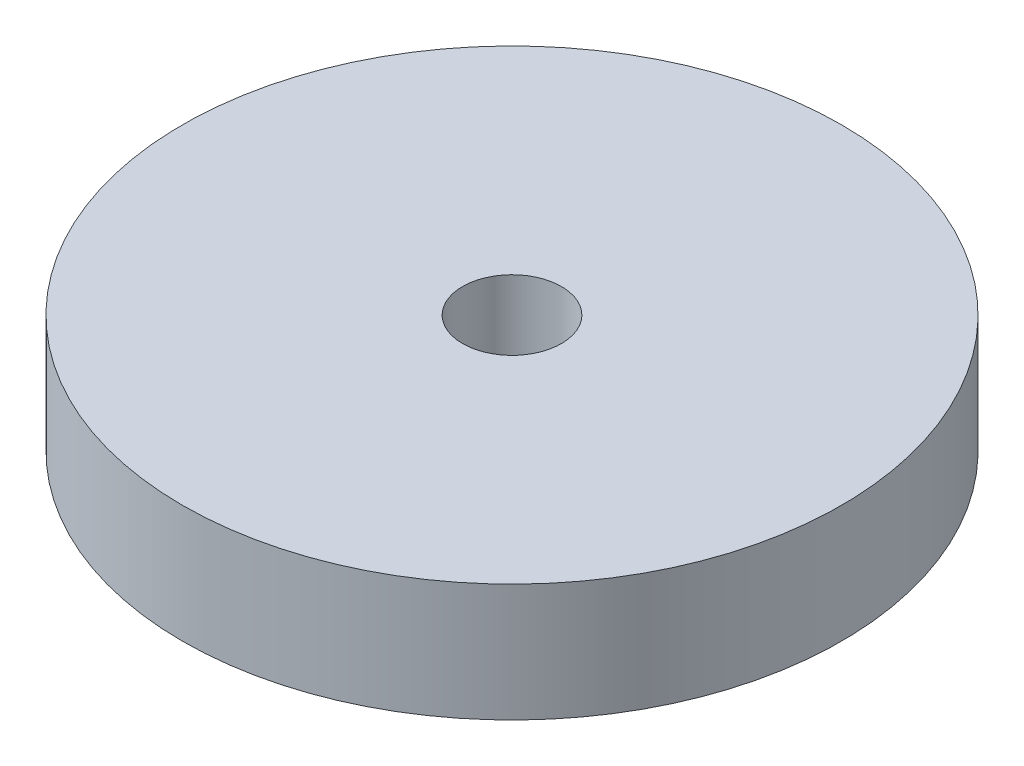
ISO-10303-21;
HEADER;
FILE_DESCRIPTION(('STEP AP214'),'2;1');
FILE_NAME('part.step','',(''),(''),'','','');
FILE_SCHEMA(('AUTOMOTIVE_DESIGN { 1 0 10303 214 1 1 1 1 }'));
ENDSEC;
DATA;
#1=APPLICATION_CONTEXT('core data for automotive mechanical design processes');
#2=APPLICATION_PROTOCOL_DEFINITION('international standard','automotive_design',2000,#1);
#3=PRODUCT_CONTEXT('',#1,'mechanical');
#4=PRODUCT('Part','Part','',(#3));
#5=PRODUCT_RELATED_PRODUCT_CATEGORY('part','',(#4));
#6=PRODUCT_DEFINITION_FORMATION('','',#4);
#7=PRODUCT_DEFINITION_CONTEXT('part definition',#1,'design');
#8=PRODUCT_DEFINITION('design','',#6,#7);
#9=PRODUCT_DEFINITION_SHAPE('','',#8);
#10=(LENGTH_UNIT() NAMED_UNIT(*) SI_UNIT(.MILLI.,.METRE.));
#11=(NAMED_UNIT(*) PLANE_ANGLE_UNIT() SI_UNIT($,.RADIAN.));
#12=(NAMED_UNIT(*) SI_UNIT($,.STERADIAN.) SOLID_ANGLE_UNIT());
#13=UNCERTAINTY_MEASURE_WITH_UNIT(LENGTH_MEASURE(1.E-05),#10,'distance_accuracy_value','');
#14=(GEOMETRIC_REPRESENTATION_CONTEXT(3) GLOBAL_UNCERTAINTY_ASSIGNED_CONTEXT((#13)) GLOBAL_UNIT_ASSIGNED_CONTEXT((#10,
#11,#12)) REPRESENTATION_CONTEXT('',''));
#15=CARTESIAN_POINT('',(0.,0.,0.));
#16=DIRECTION('',(0.,0.,1.));
#17=DIRECTION('',(1.,0.,0.));
#18=AXIS2_PLACEMENT_3D('',#15,#16,#17);
#19=CARTESIAN_POINT('',(0.,2.5,0.));
#20=DIRECTION('',(0.,1.,0.));
#21=DIRECTION('',(0.,0.,1.));
#22=AXIS2_PLACEMENT_3D('',#19,#20,#21);
#23=PLANE('',#22);
#24=CARTESIAN_POINT('',(0.,2.5,0.));
#25=DIRECTION('',(0.,1.,0.));
#26=DIRECTION('',(0.,0.,1.));
#27=AXIS2_PLACEMENT_3D('',#24,#25,#26);
#28=CIRCLE('',#27,14.);
#29=CARTESIAN_POINT('',(0.,2.5,14.));
#30=VERTEX_POINT('',#29);
#31=EDGE_CURVE('E10',#30,#30,#28,.T.);
#32=ORIENTED_EDGE('',*,*,#31,.T.);
#33=EDGE_LOOP('',(#32));
#34=FACE_BOUND('',#33,.T.);
#35=CARTESIAN_POINT('',(0.,2.5,0.));
#36=DIRECTION('',(0.,1.,0.));
#37=DIRECTION('',(0.,0.,1.));
#38=AXIS2_PLACEMENT_3D('',#35,#36,#37);
#39=CIRCLE('',#38,2.1);
#40=CARTESIAN_POINT('',(0.,2.5,2.1));
#41=VERTEX_POINT('',#40);
#42=EDGE_CURVE('E54',#41,#41,#39,.T.);
#43=ORIENTED_EDGE('',*,*,#42,.F.);
#44=EDGE_LOOP('',(#43));
#45=FACE_BOUND('',#44,.T.);
#46=ADVANCED_FACE('F43',(#34,#45),#23,.T.);
#47=CARTESIAN_POINT('',(0.,-2.5,0.));
#48=DIRECTION('',(0.,1.,0.));
#49=DIRECTION('',(0.,0.,1.));
#50=AXIS2_PLACEMENT_3D('',#47,#48,#49);
#51=PLANE('',#50);
#52=CARTESIAN_POINT('',(0.,-2.5,0.));
#53=DIRECTION('',(0.,1.,0.));
#54=DIRECTION('',(0.,0.,1.));
#55=AXIS2_PLACEMENT_3D('',#52,#53,#54);
#56=CIRCLE('',#55,14.);
#57=CARTESIAN_POINT('',(0.,-2.5,14.));
#58=VERTEX_POINT('',#57);
#59=EDGE_CURVE('E47',#58,#58,#56,.T.);
#60=ORIENTED_EDGE('',*,*,#59,.F.);
#61=EDGE_LOOP('',(#60));
#62=FACE_BOUND('',#61,.T.);
#63=CARTESIAN_POINT('',(0.,-2.5,0.));
#64=DIRECTION('',(0.,1.,0.));
#65=DIRECTION('',(0.,0.,1.));
#66=AXIS2_PLACEMENT_3D('',#63,#64,#65);
#67=CIRCLE('',#66,2.1);
#68=CARTESIAN_POINT('',(0.,-2.5,2.1));
#69=VERTEX_POINT('',#68);
#70=EDGE_CURVE('E56',#69,#69,#67,.T.);
#71=ORIENTED_EDGE('',*,*,#70,.T.);
#72=EDGE_LOOP('',(#71));
#73=FACE_BOUND('',#72,.T.);
#74=ADVANCED_FACE('F66',(#62,#73),#51,.F.);
#75=CARTESIAN_POINT('',(0.,2.5,0.));
#76=DIRECTION('',(0.,-1.,0.));
#77=DIRECTION('',(0.,0.,-1.));
#78=AXIS2_PLACEMENT_3D('',#75,#76,#77);
#79=CYLINDRICAL_SURFACE('',#78,14.);
#80=ORIENTED_EDGE('',*,*,#31,.F.);
#81=EDGE_LOOP('',(#80));
#82=FACE_BOUND('',#81,.T.);
#83=ORIENTED_EDGE('',*,*,#59,.T.);
#84=EDGE_LOOP('',(#83));
#85=FACE_BOUND('',#84,.T.);
#86=ADVANCED_FACE('F45',(#82,#85),#79,.T.);
#87=CARTESIAN_POINT('',(0.,2.5,0.));
#88=DIRECTION('',(0.,-1.,0.));
#89=DIRECTION('',(0.,0.,-1.));
#90=AXIS2_PLACEMENT_3D('',#87,#88,#89);
#91=CYLINDRICAL_SURFACE('',#90,2.1);
#92=ORIENTED_EDGE('',*,*,#42,.T.);
#93=EDGE_LOOP('',(#92));
#94=FACE_BOUND('',#93,.T.);
#95=ORIENTED_EDGE('',*,*,#70,.F.);
#96=EDGE_LOOP('',(#95));
#97=FACE_BOUND('',#96,.T.);
#98=ADVANCED_FACE('F62',(#94,#97),#91,.F.);
#99=CLOSED_SHELL('',(#46,#74,#86,#98));
#100=MANIFOLD_SOLID_BREP('B2',#99);
#101=ADVANCED_BREP_SHAPE_REPRESENTATION('',(#18,#100),#14);
#102=SHAPE_DEFINITION_REPRESENTATION(#9,#101);
ENDSEC;
END-ISO-10303-21;
